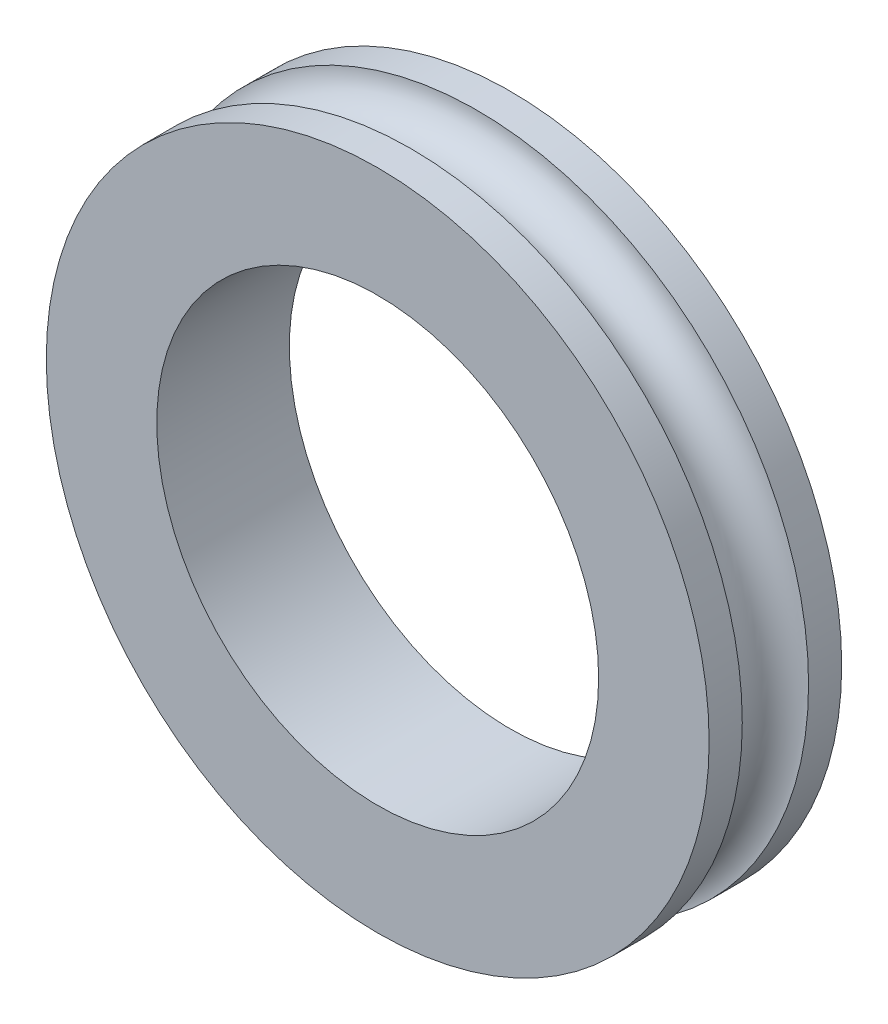
ISO-10303-21;
HEADER;
FILE_DESCRIPTION(('STEP AP214'),'2;1');
FILE_NAME('part.step','',(''),(''),'','','');
FILE_SCHEMA(('AUTOMOTIVE_DESIGN { 1 0 10303 214 1 1 1 1 }'));
ENDSEC;
DATA;
#1=APPLICATION_CONTEXT('core data for automotive mechanical design processes');
#2=APPLICATION_PROTOCOL_DEFINITION('international standard','automotive_design',2000,#1);
#3=PRODUCT_CONTEXT('',#1,'mechanical');
#4=PRODUCT('Part','Part','',(#3));
#5=PRODUCT_RELATED_PRODUCT_CATEGORY('part','',(#4));
#6=PRODUCT_DEFINITION_FORMATION('','',#4);
#7=PRODUCT_DEFINITION_CONTEXT('part definition',#1,'design');
#8=PRODUCT_DEFINITION('design','',#6,#7);
#9=PRODUCT_DEFINITION_SHAPE('','',#8);
#10=(LENGTH_UNIT() NAMED_UNIT(*) SI_UNIT(.MILLI.,.METRE.));
#11=(NAMED_UNIT(*) PLANE_ANGLE_UNIT() SI_UNIT($,.RADIAN.));
#12=(NAMED_UNIT(*) SI_UNIT($,.STERADIAN.) SOLID_ANGLE_UNIT());
#13=UNCERTAINTY_MEASURE_WITH_UNIT(LENGTH_MEASURE(1.E-05),#10,'distance_accuracy_value','');
#14=(GEOMETRIC_REPRESENTATION_CONTEXT(3) GLOBAL_UNCERTAINTY_ASSIGNED_CONTEXT((#13)) GLOBAL_UNIT_ASSIGNED_CONTEXT((#10,
#11,#12)) REPRESENTATION_CONTEXT('',''));
#15=CARTESIAN_POINT('',(0.,0.,0.));
#16=DIRECTION('',(0.,0.,1.));
#17=DIRECTION('',(1.,0.,0.));
#18=AXIS2_PLACEMENT_3D('',#15,#16,#17);
#19=CARTESIAN_POINT('',(0.,0.,3.));
#20=DIRECTION('',(0.,0.,-1.));
#21=DIRECTION('',(-1.,0.,0.));
#22=AXIS2_PLACEMENT_3D('',#19,#20,#21);
#23=CYLINDRICAL_SURFACE('',#22,7.5);
#24=CARTESIAN_POINT('',(0.,0.,3.));
#25=DIRECTION('',(0.,0.,1.));
#26=DIRECTION('',(1.,0.,0.));
#27=AXIS2_PLACEMENT_3D('',#24,#25,#26);
#28=CIRCLE('',#27,7.5);
#29=CARTESIAN_POINT('',(7.5,0.,3.));
#30=VERTEX_POINT('',#29);
#31=EDGE_CURVE('E10',#30,#30,#28,.T.);
#32=ORIENTED_EDGE('',*,*,#31,.F.);
#33=EDGE_LOOP('',(#32));
#34=FACE_BOUND('',#33,.T.);
#35=CARTESIAN_POINT('',(0.,0.,2.25));
#36=DIRECTION('',(0.,0.,-1.));
#37=DIRECTION('',(-1.,0.,0.));
#38=AXIS2_PLACEMENT_3D('',#35,#36,#37);
#39=CIRCLE('',#38,7.5);
#40=CARTESIAN_POINT('',(-7.5,0.,2.25));
#41=VERTEX_POINT('',#40);
#42=EDGE_CURVE('E33',#41,#41,#39,.T.);
#43=ORIENTED_EDGE('',*,*,#42,.F.);
#44=EDGE_LOOP('',(#43));
#45=FACE_BOUND('',#44,.T.);
#46=ADVANCED_FACE('F30',(#34,#45),#23,.T.);
#47=CARTESIAN_POINT('',(0.,0.,3.));
#48=DIRECTION('',(0.,0.,1.));
#49=DIRECTION('',(1.,0.,0.));
#50=AXIS2_PLACEMENT_3D('',#47,#48,#49);
#51=PLANE('',#50);
#52=CARTESIAN_POINT('',(0.,0.,3.));
#53=DIRECTION('',(0.,0.,1.));
#54=DIRECTION('',(1.,0.,0.));
#55=AXIS2_PLACEMENT_3D('',#52,#53,#54);
#56=CIRCLE('',#55,5.);
#57=CARTESIAN_POINT('',(5.,0.,3.));
#58=VERTEX_POINT('',#57);
#59=EDGE_CURVE('E44',#58,#58,#56,.T.);
#60=ORIENTED_EDGE('',*,*,#59,.F.);
#61=EDGE_LOOP('',(#60));
#62=FACE_BOUND('',#61,.T.);
#63=ORIENTED_EDGE('',*,*,#31,.T.);
#64=EDGE_LOOP('',(#63));
#65=FACE_BOUND('',#64,.T.);
#66=ADVANCED_FACE('F60',(#62,#65),#51,.T.);
#67=CARTESIAN_POINT('',(0.,0.,1.5));
#68=DIRECTION('',(0.,0.,1.));
#69=DIRECTION('',(1.,0.,0.));
#70=AXIS2_PLACEMENT_3D('',#67,#68,#69);
#71=TOROIDAL_SURFACE('',#70,7.5,0.75);
#72=CARTESIAN_POINT('',(0.,0.,0.75));
#73=DIRECTION('',(0.,0.,1.));
#74=DIRECTION('',(1.,0.,0.));
#75=AXIS2_PLACEMENT_3D('',#72,#73,#74);
#76=CIRCLE('',#75,7.5);
#77=CARTESIAN_POINT('',(7.5,0.,0.75));
#78=VERTEX_POINT('',#77);
#79=EDGE_CURVE('E46',#78,#78,#76,.T.);
#80=ORIENTED_EDGE('',*,*,#79,.T.);
#81=EDGE_LOOP('',(#80));
#82=FACE_BOUND('',#81,.T.);
#83=ORIENTED_EDGE('',*,*,#42,.T.);
#84=EDGE_LOOP('',(#83));
#85=FACE_BOUND('',#84,.T.);
#86=ADVANCED_FACE('F62',(#82,#85),#71,.F.);
#87=CARTESIAN_POINT('',(0.,0.,0.));
#88=DIRECTION('',(0.,0.,1.));
#89=DIRECTION('',(1.,0.,0.));
#90=AXIS2_PLACEMENT_3D('',#87,#88,#89);
#91=PLANE('',#90);
#92=CARTESIAN_POINT('',(0.,0.,0.));
#93=DIRECTION('',(0.,0.,1.));
#94=DIRECTION('',(1.,0.,0.));
#95=AXIS2_PLACEMENT_3D('',#92,#93,#94);
#96=CIRCLE('',#95,5.);
#97=CARTESIAN_POINT('',(5.,0.,0.));
#98=VERTEX_POINT('',#97);
#99=EDGE_CURVE('E48',#98,#98,#96,.T.);
#100=ORIENTED_EDGE('',*,*,#99,.T.);
#101=EDGE_LOOP('',(#100));
#102=FACE_BOUND('',#101,.T.);
#103=CARTESIAN_POINT('',(0.,0.,0.));
#104=DIRECTION('',(0.,0.,1.));
#105=DIRECTION('',(1.,0.,0.));
#106=AXIS2_PLACEMENT_3D('',#103,#104,#105);
#107=CIRCLE('',#106,7.5);
#108=CARTESIAN_POINT('',(7.5,0.,0.));
#109=VERTEX_POINT('',#108);
#110=EDGE_CURVE('E37',#109,#109,#107,.T.);
#111=ORIENTED_EDGE('',*,*,#110,.F.);
#112=EDGE_LOOP('',(#111));
#113=FACE_BOUND('',#112,.T.);
#114=ADVANCED_FACE('F68',(#102,#113),#91,.F.);
#115=ORIENTED_EDGE('',*,*,#110,.T.);
#116=EDGE_LOOP('',(#115));
#117=FACE_BOUND('',#116,.T.);
#118=ORIENTED_EDGE('',*,*,#79,.F.);
#119=EDGE_LOOP('',(#118));
#120=FACE_BOUND('',#119,.T.);
#121=ADVANCED_FACE('F71',(#117,#120),#23,.T.);
#122=CARTESIAN_POINT('',(0.,0.,0.));
#123=DIRECTION('',(0.,0.,1.));
#124=DIRECTION('',(1.,0.,0.));
#125=AXIS2_PLACEMENT_3D('',#122,#123,#124);
#126=CYLINDRICAL_SURFACE('',#125,5.);
#127=ORIENTED_EDGE('',*,*,#99,.F.);
#128=EDGE_LOOP('',(#127));
#129=FACE_BOUND('',#128,.T.);
#130=ORIENTED_EDGE('',*,*,#59,.T.);
#131=EDGE_LOOP('',(#130));
#132=FACE_BOUND('',#131,.T.);
#133=ADVANCED_FACE('F58',(#129,#132),#126,.F.);
#134=CLOSED_SHELL('',(#46,#66,#86,#114,#121,#133));
#135=MANIFOLD_SOLID_BREP('B2',#134);
#136=ADVANCED_BREP_SHAPE_REPRESENTATION('',(#18,#135),#14);
#137=SHAPE_DEFINITION_REPRESENTATION(#9,#136);
ENDSEC;
END-ISO-10303-21;
